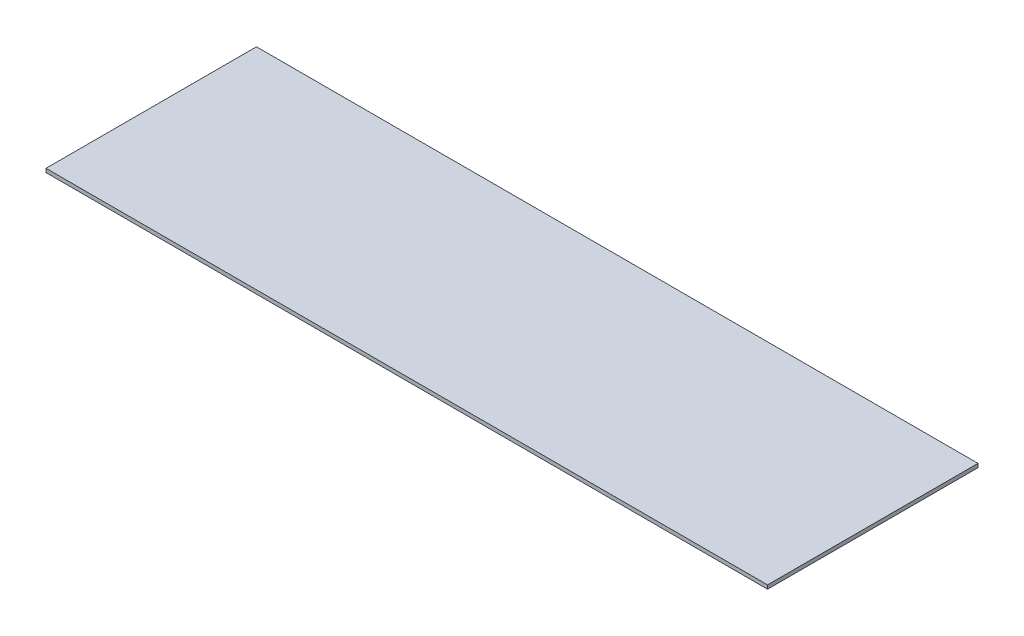
ISO-10303-21;
HEADER;
FILE_DESCRIPTION(('STEP AP214'),'2;1');
FILE_NAME('part.step','',(''),(''),'','','');
FILE_SCHEMA(('AUTOMOTIVE_DESIGN { 1 0 10303 214 1 1 1 1 }'));
ENDSEC;
DATA;
#1=APPLICATION_CONTEXT('core data for automotive mechanical design processes');
#2=APPLICATION_PROTOCOL_DEFINITION('international standard','automotive_design',2000,#1);
#3=PRODUCT_CONTEXT('',#1,'mechanical');
#4=PRODUCT('Part','Part','',(#3));
#5=PRODUCT_RELATED_PRODUCT_CATEGORY('part','',(#4));
#6=PRODUCT_DEFINITION_FORMATION('','',#4);
#7=PRODUCT_DEFINITION_CONTEXT('part definition',#1,'design');
#8=PRODUCT_DEFINITION('design','',#6,#7);
#9=PRODUCT_DEFINITION_SHAPE('','',#8);
#10=(LENGTH_UNIT() NAMED_UNIT(*) SI_UNIT(.MILLI.,.METRE.));
#11=(NAMED_UNIT(*) PLANE_ANGLE_UNIT() SI_UNIT($,.RADIAN.));
#12=(NAMED_UNIT(*) SI_UNIT($,.STERADIAN.) SOLID_ANGLE_UNIT());
#13=UNCERTAINTY_MEASURE_WITH_UNIT(LENGTH_MEASURE(1.E-05),#10,'distance_accuracy_value','');
#14=(GEOMETRIC_REPRESENTATION_CONTEXT(3) GLOBAL_UNCERTAINTY_ASSIGNED_CONTEXT((#13)) GLOBAL_UNIT_ASSIGNED_CONTEXT((#10,
#11,#12)) REPRESENTATION_CONTEXT('',''));
#15=CARTESIAN_POINT('',(0.,0.,0.));
#16=DIRECTION('',(0.,0.,1.));
#17=DIRECTION('',(1.,0.,0.));
#18=AXIS2_PLACEMENT_3D('',#15,#16,#17);
#19=CARTESIAN_POINT('',(1219.2,12.7,355.6));
#20=DIRECTION('',(-1.,0.,0.));
#21=DIRECTION('',(0.,0.,1.));
#22=AXIS2_PLACEMENT_3D('',#19,#20,#21);
#23=PLANE('',#22);
#24=DIRECTION('',(0.,0.,-1.));
#25=VECTOR('',#24,1.);
#26=CARTESIAN_POINT('',(1219.2,0.,355.6));
#27=LINE('',#26,#25);
#28=CARTESIAN_POINT('',(1219.2,0.,355.6));
#29=VERTEX_POINT('',#28);
#30=CARTESIAN_POINT('',(1219.2,0.,-355.6));
#31=VERTEX_POINT('',#30);
#32=EDGE_CURVE('E107',#29,#31,#27,.T.);
#33=ORIENTED_EDGE('',*,*,#32,.T.);
#34=DIRECTION('',(0.,-1.,0.));
#35=VECTOR('',#34,1.);
#36=CARTESIAN_POINT('',(1219.2,12.7,-355.6));
#37=LINE('',#36,#35);
#38=CARTESIAN_POINT('',(1219.2,12.7,-355.6));
#39=VERTEX_POINT('',#38);
#40=EDGE_CURVE('E11',#39,#31,#37,.T.);
#41=ORIENTED_EDGE('',*,*,#40,.F.);
#42=DIRECTION('',(0.,0.,-1.));
#43=VECTOR('',#42,1.);
#44=CARTESIAN_POINT('',(1219.2,12.7,355.6));
#45=LINE('',#44,#43);
#46=CARTESIAN_POINT('',(1219.2,12.7,355.6));
#47=VERTEX_POINT('',#46);
#48=EDGE_CURVE('E91',#47,#39,#45,.T.);
#49=ORIENTED_EDGE('',*,*,#48,.F.);
#50=DIRECTION('',(0.,-1.,0.));
#51=VECTOR('',#50,1.);
#52=CARTESIAN_POINT('',(1219.2,12.7,355.6));
#53=LINE('',#52,#51);
#54=EDGE_CURVE('E103',#47,#29,#53,.T.);
#55=ORIENTED_EDGE('',*,*,#54,.T.);
#56=EDGE_LOOP('',(#33,#41,#49,#55));
#57=FACE_BOUND('',#56,.T.);
#58=ADVANCED_FACE('F39',(#57),#23,.F.);
#59=CARTESIAN_POINT('',(-1219.2,12.7,-355.6));
#60=DIRECTION('',(0.,0.,1.));
#61=DIRECTION('',(1.,0.,0.));
#62=AXIS2_PLACEMENT_3D('',#59,#60,#61);
#63=PLANE('',#62);
#64=DIRECTION('',(-1.,0.,0.));
#65=VECTOR('',#64,1.);
#66=CARTESIAN_POINT('',(-1219.2,0.,-355.6));
#67=LINE('',#66,#65);
#68=CARTESIAN_POINT('',(-1219.2,0.,-355.6));
#69=VERTEX_POINT('',#68);
#70=EDGE_CURVE('E96',#31,#69,#67,.T.);
#71=ORIENTED_EDGE('',*,*,#70,.T.);
#72=DIRECTION('',(0.,-1.,0.));
#73=VECTOR('',#72,1.);
#74=CARTESIAN_POINT('',(-1219.2,12.7,-355.6));
#75=LINE('',#74,#73);
#76=CARTESIAN_POINT('',(-1219.2,12.7,-355.6));
#77=VERTEX_POINT('',#76);
#78=EDGE_CURVE('E48',#77,#69,#75,.T.);
#79=ORIENTED_EDGE('',*,*,#78,.F.);
#80=DIRECTION('',(-1.,0.,0.));
#81=VECTOR('',#80,1.);
#82=CARTESIAN_POINT('',(-1219.2,12.7,-355.6));
#83=LINE('',#82,#81);
#84=EDGE_CURVE('E86',#39,#77,#83,.T.);
#85=ORIENTED_EDGE('',*,*,#84,.F.);
#86=ORIENTED_EDGE('',*,*,#40,.T.);
#87=EDGE_LOOP('',(#71,#79,#85,#86));
#88=FACE_BOUND('',#87,.T.);
#89=ADVANCED_FACE('F95',(#88),#63,.F.);
#90=CARTESIAN_POINT('',(-1219.2,12.7,355.6));
#91=DIRECTION('',(1.,0.,0.));
#92=DIRECTION('',(0.,0.,-1.));
#93=AXIS2_PLACEMENT_3D('',#90,#91,#92);
#94=PLANE('',#93);
#95=DIRECTION('',(0.,0.,1.));
#96=VECTOR('',#95,1.);
#97=CARTESIAN_POINT('',(-1219.2,0.,355.6));
#98=LINE('',#97,#96);
#99=CARTESIAN_POINT('',(-1219.2,0.,355.6));
#100=VERTEX_POINT('',#99);
#101=EDGE_CURVE('E73',#69,#100,#98,.T.);
#102=ORIENTED_EDGE('',*,*,#101,.T.);
#103=DIRECTION('',(0.,-1.,0.));
#104=VECTOR('',#103,1.);
#105=CARTESIAN_POINT('',(-1219.2,12.7,355.6));
#106=LINE('',#105,#104);
#107=CARTESIAN_POINT('',(-1219.2,12.7,355.6));
#108=VERTEX_POINT('',#107);
#109=EDGE_CURVE('E98',#108,#100,#106,.T.);
#110=ORIENTED_EDGE('',*,*,#109,.F.);
#111=DIRECTION('',(0.,0.,1.));
#112=VECTOR('',#111,1.);
#113=CARTESIAN_POINT('',(-1219.2,12.7,355.6));
#114=LINE('',#113,#112);
#115=EDGE_CURVE('E89',#77,#108,#114,.T.);
#116=ORIENTED_EDGE('',*,*,#115,.F.);
#117=ORIENTED_EDGE('',*,*,#78,.T.);
#118=EDGE_LOOP('',(#102,#110,#116,#117));
#119=FACE_BOUND('',#118,.T.);
#120=ADVANCED_FACE('F99',(#119),#94,.F.);
#121=CARTESIAN_POINT('',(-1219.2,12.7,355.6));
#122=DIRECTION('',(0.,0.,-1.));
#123=DIRECTION('',(-1.,0.,0.));
#124=AXIS2_PLACEMENT_3D('',#121,#122,#123);
#125=PLANE('',#124);
#126=DIRECTION('',(1.,0.,0.));
#127=VECTOR('',#126,1.);
#128=CARTESIAN_POINT('',(-1219.2,0.,355.6));
#129=LINE('',#128,#127);
#130=EDGE_CURVE('E79',#100,#29,#129,.T.);
#131=ORIENTED_EDGE('',*,*,#130,.T.);
#132=ORIENTED_EDGE('',*,*,#54,.F.);
#133=DIRECTION('',(1.,0.,0.));
#134=VECTOR('',#133,1.);
#135=CARTESIAN_POINT('',(-1219.2,12.7,355.6));
#136=LINE('',#135,#134);
#137=EDGE_CURVE('E56',#108,#47,#136,.T.);
#138=ORIENTED_EDGE('',*,*,#137,.F.);
#139=ORIENTED_EDGE('',*,*,#109,.T.);
#140=EDGE_LOOP('',(#131,#132,#138,#139));
#141=FACE_BOUND('',#140,.T.);
#142=ADVANCED_FACE('F120',(#141),#125,.F.);
#143=CARTESIAN_POINT('',(0.,12.7,0.));
#144=DIRECTION('',(0.,-1.,0.));
#145=DIRECTION('',(0.,0.,-1.));
#146=AXIS2_PLACEMENT_3D('',#143,#144,#145);
#147=PLANE('',#146);
#148=ORIENTED_EDGE('',*,*,#48,.T.);
#149=ORIENTED_EDGE('',*,*,#84,.T.);
#150=ORIENTED_EDGE('',*,*,#115,.T.);
#151=ORIENTED_EDGE('',*,*,#137,.T.);
#152=EDGE_LOOP('',(#148,#149,#150,#151));
#153=FACE_BOUND('',#152,.T.);
#154=ADVANCED_FACE('F87',(#153),#147,.F.);
#155=CARTESIAN_POINT('',(0.,0.,0.));
#156=DIRECTION('',(0.,-1.,0.));
#157=DIRECTION('',(0.,0.,-1.));
#158=AXIS2_PLACEMENT_3D('',#155,#156,#157);
#159=PLANE('',#158);
#160=ORIENTED_EDGE('',*,*,#32,.F.);
#161=ORIENTED_EDGE('',*,*,#130,.F.);
#162=ORIENTED_EDGE('',*,*,#101,.F.);
#163=ORIENTED_EDGE('',*,*,#70,.F.);
#164=EDGE_LOOP('',(#160,#161,#162,#163));
#165=FACE_BOUND('',#164,.T.);
#166=ADVANCED_FACE('F123',(#165),#159,.T.);
#167=CLOSED_SHELL('',(#58,#89,#120,#142,#154,#166));
#168=MANIFOLD_SOLID_BREP('B2',#167);
#169=ADVANCED_BREP_SHAPE_REPRESENTATION('',(#18,#168),#14);
#170=SHAPE_DEFINITION_REPRESENTATION(#9,#169);
ENDSEC;
END-ISO-10303-21;
